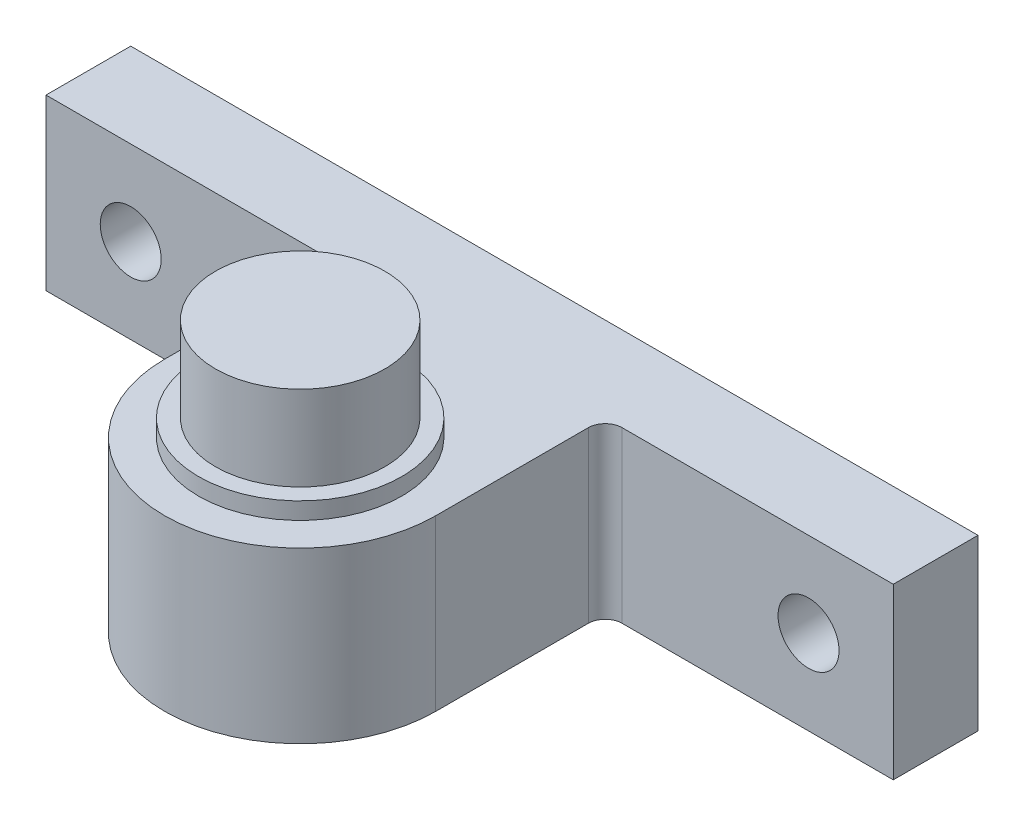
ISO-10303-21;
HEADER;
FILE_DESCRIPTION(('STEP AP214'),'2;1');
FILE_NAME('part.step','',(''),(''),'','','');
FILE_SCHEMA(('AUTOMOTIVE_DESIGN { 1 0 10303 214 1 1 1 1 }'));
ENDSEC;
DATA;
#1=APPLICATION_CONTEXT('core data for automotive mechanical design processes');
#2=APPLICATION_PROTOCOL_DEFINITION('international standard','automotive_design',2000,#1);
#3=PRODUCT_CONTEXT('',#1,'mechanical');
#4=PRODUCT('Part','Part','',(#3));
#5=PRODUCT_RELATED_PRODUCT_CATEGORY('part','',(#4));
#6=PRODUCT_DEFINITION_FORMATION('','',#4);
#7=PRODUCT_DEFINITION_CONTEXT('part definition',#1,'design');
#8=PRODUCT_DEFINITION('design','',#6,#7);
#9=PRODUCT_DEFINITION_SHAPE('','',#8);
#10=(LENGTH_UNIT() NAMED_UNIT(*) SI_UNIT(.MILLI.,.METRE.));
#11=(NAMED_UNIT(*) PLANE_ANGLE_UNIT() SI_UNIT($,.RADIAN.));
#12=(NAMED_UNIT(*) SI_UNIT($,.STERADIAN.) SOLID_ANGLE_UNIT());
#13=UNCERTAINTY_MEASURE_WITH_UNIT(LENGTH_MEASURE(1.E-05),#10,'distance_accuracy_value','');
#14=(GEOMETRIC_REPRESENTATION_CONTEXT(3) GLOBAL_UNCERTAINTY_ASSIGNED_CONTEXT((#13)) GLOBAL_UNIT_ASSIGNED_CONTEXT((#10,
#11,#12)) REPRESENTATION_CONTEXT('',''));
#15=CARTESIAN_POINT('',(0.,0.,0.));
#16=DIRECTION('',(0.,0.,1.));
#17=DIRECTION('',(1.,0.,0.));
#18=AXIS2_PLACEMENT_3D('',#15,#16,#17);
#19=CARTESIAN_POINT('',(0.,10.,0.));
#20=DIRECTION('',(0.,-1.,0.));
#21=DIRECTION('',(0.,0.,-1.));
#22=AXIS2_PLACEMENT_3D('',#19,#20,#21);
#23=CYLINDRICAL_SURFACE('',#22,8.);
#24=CARTESIAN_POINT('',(0.,0.,0.));
#25=DIRECTION('',(0.,1.,0.));
#26=DIRECTION('',(0.,0.,1.));
#27=AXIS2_PLACEMENT_3D('',#24,#25,#26);
#28=CIRCLE('',#27,8.);
#29=CARTESIAN_POINT('',(8.,0.,0.));
#30=VERTEX_POINT('',#29);
#31=CARTESIAN_POINT('',(-8.,0.,0.));
#32=VERTEX_POINT('',#31);
#33=EDGE_CURVE('E130',#30,#32,#28,.F.);
#34=ORIENTED_EDGE('',*,*,#33,.F.);
#35=DIRECTION('',(0.,-1.,0.));
#36=VECTOR('',#35,1.);
#37=CARTESIAN_POINT('',(8.,10.,0.));
#38=LINE('',#37,#36);
#39=CARTESIAN_POINT('',(8.,10.,0.));
#40=VERTEX_POINT('',#39);
#41=EDGE_CURVE('E125',#40,#30,#38,.T.);
#42=ORIENTED_EDGE('',*,*,#41,.F.);
#43=CARTESIAN_POINT('',(0.,10.,0.));
#44=DIRECTION('',(0.,1.,0.));
#45=DIRECTION('',(0.,0.,1.));
#46=AXIS2_PLACEMENT_3D('',#43,#44,#45);
#47=CIRCLE('',#46,8.);
#48=CARTESIAN_POINT('',(-8.,10.,0.));
#49=VERTEX_POINT('',#48);
#50=EDGE_CURVE('E127',#40,#49,#47,.F.);
#51=ORIENTED_EDGE('',*,*,#50,.T.);
#52=DIRECTION('',(0.,-1.,0.));
#53=VECTOR('',#52,1.);
#54=CARTESIAN_POINT('',(-8.,10.,0.));
#55=LINE('',#54,#53);
#56=EDGE_CURVE('E174',#49,#32,#55,.T.);
#57=ORIENTED_EDGE('',*,*,#56,.T.);
#58=EDGE_LOOP('',(#34,#42,#51,#57));
#59=FACE_BOUND('',#58,.T.);
#60=ADVANCED_FACE('F47',(#59),#23,.T.);
#61=CARTESIAN_POINT('',(8.,10.,0.));
#62=DIRECTION('',(-1.,0.,0.));
#63=DIRECTION('',(0.,0.,1.));
#64=AXIS2_PLACEMENT_3D('',#61,#62,#63);
#65=PLANE('',#64);
#66=DIRECTION('',(0.,0.,-1.));
#67=VECTOR('',#66,1.);
#68=CARTESIAN_POINT('',(8.,0.,0.));
#69=LINE('',#68,#67);
#70=CARTESIAN_POINT('',(8.,0.,-9.));
#71=VERTEX_POINT('',#70);
#72=EDGE_CURVE('E177',#30,#71,#69,.T.);
#73=ORIENTED_EDGE('',*,*,#72,.T.);
#74=DIRECTION('',(0.,-1.,0.));
#75=VECTOR('',#74,1.);
#76=CARTESIAN_POINT('',(8.,10.,-9.));
#77=LINE('',#76,#75);
#78=CARTESIAN_POINT('',(8.,10.,-9.));
#79=VERTEX_POINT('',#78);
#80=EDGE_CURVE('E63',#71,#79,#77,.F.);
#81=ORIENTED_EDGE('',*,*,#80,.T.);
#82=DIRECTION('',(0.,0.,-1.));
#83=VECTOR('',#82,1.);
#84=CARTESIAN_POINT('',(8.,10.,0.));
#85=LINE('',#84,#83);
#86=EDGE_CURVE('E135',#40,#79,#85,.T.);
#87=ORIENTED_EDGE('',*,*,#86,.F.);
#88=ORIENTED_EDGE('',*,*,#41,.T.);
#89=EDGE_LOOP('',(#73,#81,#87,#88));
#90=FACE_BOUND('',#89,.T.);
#91=ADVANCED_FACE('F136',(#90),#65,.F.);
#92=CARTESIAN_POINT('',(0.,10.,-10.));
#93=DIRECTION('',(0.,0.,-1.));
#94=DIRECTION('',(-1.,0.,0.));
#95=AXIS2_PLACEMENT_3D('',#92,#93,#94);
#96=PLANE('',#95);
#97=CARTESIAN_POINT('',(20.,4.99999999999999,-10.));
#98=DIRECTION('',(0.,0.,-1.));
#99=DIRECTION('',(-1.,0.,0.));
#100=AXIS2_PLACEMENT_3D('',#97,#98,#99);
#101=CIRCLE('',#100,1.8);
#102=CARTESIAN_POINT('',(18.2,4.99999999999999,-10.));
#103=VERTEX_POINT('',#102);
#104=EDGE_CURVE('E221',#103,#103,#101,.T.);
#105=ORIENTED_EDGE('',*,*,#104,.T.);
#106=EDGE_LOOP('',(#105));
#107=FACE_BOUND('',#106,.T.);
#108=DIRECTION('',(1.,0.,0.));
#109=VECTOR('',#108,1.);
#110=CARTESIAN_POINT('',(0.,10.,-10.));
#111=LINE('',#110,#109);
#112=CARTESIAN_POINT('',(9.,10.,-10.));
#113=VERTEX_POINT('',#112);
#114=CARTESIAN_POINT('',(25.,10.,-10.));
#115=VERTEX_POINT('',#114);
#116=EDGE_CURVE('E140',#113,#115,#111,.T.);
#117=ORIENTED_EDGE('',*,*,#116,.F.);
#118=DIRECTION('',(0.,-1.,0.));
#119=VECTOR('',#118,1.);
#120=CARTESIAN_POINT('',(9.,0.,-10.));
#121=LINE('',#120,#119);
#122=CARTESIAN_POINT('',(9.,0.,-10.));
#123=VERTEX_POINT('',#122);
#124=EDGE_CURVE('E229',#113,#123,#121,.T.);
#125=ORIENTED_EDGE('',*,*,#124,.T.);
#126=DIRECTION('',(1.,0.,0.));
#127=VECTOR('',#126,1.);
#128=CARTESIAN_POINT('',(0.,0.,-10.));
#129=LINE('',#128,#127);
#130=CARTESIAN_POINT('',(25.,0.,-10.));
#131=VERTEX_POINT('',#130);
#132=EDGE_CURVE('E180',#123,#131,#129,.T.);
#133=ORIENTED_EDGE('',*,*,#132,.T.);
#134=DIRECTION('',(0.,-1.,0.));
#135=VECTOR('',#134,1.);
#136=CARTESIAN_POINT('',(25.,10.,-10.));
#137=LINE('',#136,#135);
#138=EDGE_CURVE('E133',#115,#131,#137,.T.);
#139=ORIENTED_EDGE('',*,*,#138,.F.);
#140=EDGE_LOOP('',(#117,#125,#133,#139));
#141=FACE_BOUND('',#140,.T.);
#142=ADVANCED_FACE('F271',(#107,#141),#96,.F.);
#143=CARTESIAN_POINT('',(25.,10.,0.));
#144=DIRECTION('',(-1.,0.,0.));
#145=DIRECTION('',(0.,0.,1.));
#146=AXIS2_PLACEMENT_3D('',#143,#144,#145);
#147=PLANE('',#146);
#148=DIRECTION('',(0.,0.,-1.));
#149=VECTOR('',#148,1.);
#150=CARTESIAN_POINT('',(25.,0.,0.));
#151=LINE('',#150,#149);
#152=CARTESIAN_POINT('',(25.,0.,-15.));
#153=VERTEX_POINT('',#152);
#154=EDGE_CURVE('E183',#131,#153,#151,.T.);
#155=ORIENTED_EDGE('',*,*,#154,.T.);
#156=DIRECTION('',(0.,-1.,0.));
#157=VECTOR('',#156,1.);
#158=CARTESIAN_POINT('',(25.,10.,-15.));
#159=LINE('',#158,#157);
#160=CARTESIAN_POINT('',(25.,10.,-15.));
#161=VERTEX_POINT('',#160);
#162=EDGE_CURVE('E206',#161,#153,#159,.T.);
#163=ORIENTED_EDGE('',*,*,#162,.F.);
#164=DIRECTION('',(0.,0.,-1.));
#165=VECTOR('',#164,1.);
#166=CARTESIAN_POINT('',(25.,10.,0.));
#167=LINE('',#166,#165);
#168=EDGE_CURVE('E158',#115,#161,#167,.T.);
#169=ORIENTED_EDGE('',*,*,#168,.F.);
#170=ORIENTED_EDGE('',*,*,#138,.T.);
#171=EDGE_LOOP('',(#155,#163,#169,#170));
#172=FACE_BOUND('',#171,.T.);
#173=ADVANCED_FACE('F267',(#172),#147,.F.);
#174=CARTESIAN_POINT('',(0.,10.,-15.));
#175=DIRECTION('',(0.,0.,-1.));
#176=DIRECTION('',(-1.,0.,0.));
#177=AXIS2_PLACEMENT_3D('',#174,#175,#176);
#178=PLANE('',#177);
#179=CARTESIAN_POINT('',(-20.,5.,-15.));
#180=DIRECTION('',(0.,0.,-1.));
#181=DIRECTION('',(-1.,0.,0.));
#182=AXIS2_PLACEMENT_3D('',#179,#180,#181);
#183=CIRCLE('',#182,1.8);
#184=CARTESIAN_POINT('',(-21.8,5.,-15.));
#185=VERTEX_POINT('',#184);
#186=EDGE_CURVE('E222',#185,#185,#183,.T.);
#187=ORIENTED_EDGE('',*,*,#186,.F.);
#188=EDGE_LOOP('',(#187));
#189=FACE_BOUND('',#188,.T.);
#190=CARTESIAN_POINT('',(20.,4.99999999999999,-15.));
#191=DIRECTION('',(0.,0.,-1.));
#192=DIRECTION('',(-1.,0.,0.));
#193=AXIS2_PLACEMENT_3D('',#190,#191,#192);
#194=CIRCLE('',#193,1.8);
#195=CARTESIAN_POINT('',(18.2,4.99999999999999,-15.));
#196=VERTEX_POINT('',#195);
#197=EDGE_CURVE('E335',#196,#196,#194,.T.);
#198=ORIENTED_EDGE('',*,*,#197,.F.);
#199=EDGE_LOOP('',(#198));
#200=FACE_BOUND('',#199,.T.);
#201=DIRECTION('',(1.,0.,0.));
#202=VECTOR('',#201,1.);
#203=CARTESIAN_POINT('',(0.,0.,-15.));
#204=LINE('',#203,#202);
#205=CARTESIAN_POINT('',(-25.,0.,-15.));
#206=VERTEX_POINT('',#205);
#207=EDGE_CURVE('E187',#206,#153,#204,.T.);
#208=ORIENTED_EDGE('',*,*,#207,.F.);
#209=DIRECTION('',(0.,-1.,0.));
#210=VECTOR('',#209,1.);
#211=CARTESIAN_POINT('',(-25.,10.,-15.));
#212=LINE('',#211,#210);
#213=CARTESIAN_POINT('',(-25.,10.,-15.));
#214=VERTEX_POINT('',#213);
#215=EDGE_CURVE('E203',#214,#206,#212,.T.);
#216=ORIENTED_EDGE('',*,*,#215,.F.);
#217=DIRECTION('',(1.,0.,0.));
#218=VECTOR('',#217,1.);
#219=CARTESIAN_POINT('',(0.,10.,-15.));
#220=LINE('',#219,#218);
#221=EDGE_CURVE('E161',#214,#161,#220,.T.);
#222=ORIENTED_EDGE('',*,*,#221,.T.);
#223=ORIENTED_EDGE('',*,*,#162,.T.);
#224=EDGE_LOOP('',(#208,#216,#222,#223));
#225=FACE_BOUND('',#224,.T.);
#226=ADVANCED_FACE('F262',(#189,#200,#225),#178,.T.);
#227=CARTESIAN_POINT('',(-25.,10.,0.));
#228=DIRECTION('',(-1.,0.,0.));
#229=DIRECTION('',(0.,0.,1.));
#230=AXIS2_PLACEMENT_3D('',#227,#228,#229);
#231=PLANE('',#230);
#232=DIRECTION('',(0.,0.,-1.));
#233=VECTOR('',#232,1.);
#234=CARTESIAN_POINT('',(-25.,0.,0.));
#235=LINE('',#234,#233);
#236=CARTESIAN_POINT('',(-25.,0.,-10.));
#237=VERTEX_POINT('',#236);
#238=EDGE_CURVE('E191',#237,#206,#235,.T.);
#239=ORIENTED_EDGE('',*,*,#238,.F.);
#240=DIRECTION('',(0.,-1.,0.));
#241=VECTOR('',#240,1.);
#242=CARTESIAN_POINT('',(-25.,10.,-10.));
#243=LINE('',#242,#241);
#244=CARTESIAN_POINT('',(-25.,10.,-10.));
#245=VERTEX_POINT('',#244);
#246=EDGE_CURVE('E199',#245,#237,#243,.T.);
#247=ORIENTED_EDGE('',*,*,#246,.F.);
#248=DIRECTION('',(0.,0.,-1.));
#249=VECTOR('',#248,1.);
#250=CARTESIAN_POINT('',(-25.,10.,0.));
#251=LINE('',#250,#249);
#252=EDGE_CURVE('E165',#245,#214,#251,.T.);
#253=ORIENTED_EDGE('',*,*,#252,.T.);
#254=ORIENTED_EDGE('',*,*,#215,.T.);
#255=EDGE_LOOP('',(#239,#247,#253,#254));
#256=FACE_BOUND('',#255,.T.);
#257=ADVANCED_FACE('F258',(#256),#231,.T.);
#258=CARTESIAN_POINT('',(0.,10.,-10.));
#259=DIRECTION('',(0.,0.,1.));
#260=DIRECTION('',(1.,0.,0.));
#261=AXIS2_PLACEMENT_3D('',#258,#259,#260);
#262=PLANE('',#261);
#263=CARTESIAN_POINT('',(-20.,5.,-10.));
#264=DIRECTION('',(0.,0.,1.));
#265=DIRECTION('',(1.,0.,0.));
#266=AXIS2_PLACEMENT_3D('',#263,#264,#265);
#267=CIRCLE('',#266,1.8);
#268=CARTESIAN_POINT('',(-18.2,5.,-10.));
#269=VERTEX_POINT('',#268);
#270=EDGE_CURVE('E217',#269,#269,#267,.T.);
#271=ORIENTED_EDGE('',*,*,#270,.F.);
#272=EDGE_LOOP('',(#271));
#273=FACE_BOUND('',#272,.T.);
#274=DIRECTION('',(-1.,0.,0.));
#275=VECTOR('',#274,1.);
#276=CARTESIAN_POINT('',(0.,0.,-10.));
#277=LINE('',#276,#275);
#278=CARTESIAN_POINT('',(-9.,0.,-10.));
#279=VERTEX_POINT('',#278);
#280=EDGE_CURVE('E150',#279,#237,#277,.T.);
#281=ORIENTED_EDGE('',*,*,#280,.F.);
#282=DIRECTION('',(0.,-1.,0.));
#283=VECTOR('',#282,1.);
#284=CARTESIAN_POINT('',(-9.,10.,-10.));
#285=LINE('',#284,#283);
#286=CARTESIAN_POINT('',(-9.,10.,-10.));
#287=VERTEX_POINT('',#286);
#288=EDGE_CURVE('E226',#279,#287,#285,.F.);
#289=ORIENTED_EDGE('',*,*,#288,.T.);
#290=DIRECTION('',(-1.,0.,0.));
#291=VECTOR('',#290,1.);
#292=CARTESIAN_POINT('',(0.,10.,-10.));
#293=LINE('',#292,#291);
#294=EDGE_CURVE('E169',#287,#245,#293,.T.);
#295=ORIENTED_EDGE('',*,*,#294,.T.);
#296=ORIENTED_EDGE('',*,*,#246,.T.);
#297=EDGE_LOOP('',(#281,#289,#295,#296));
#298=FACE_BOUND('',#297,.T.);
#299=ADVANCED_FACE('F254',(#273,#298),#262,.T.);
#300=CARTESIAN_POINT('',(-8.,10.,0.));
#301=DIRECTION('',(-1.,0.,0.));
#302=DIRECTION('',(0.,0.,1.));
#303=AXIS2_PLACEMENT_3D('',#300,#301,#302);
#304=PLANE('',#303);
#305=DIRECTION('',(0.,0.,-1.));
#306=VECTOR('',#305,1.);
#307=CARTESIAN_POINT('',(-8.,10.,0.));
#308=LINE('',#307,#306);
#309=CARTESIAN_POINT('',(-8.,10.,-9.));
#310=VERTEX_POINT('',#309);
#311=EDGE_CURVE('E144',#49,#310,#308,.T.);
#312=ORIENTED_EDGE('',*,*,#311,.T.);
#313=DIRECTION('',(0.,-1.,0.));
#314=VECTOR('',#313,1.);
#315=CARTESIAN_POINT('',(-8.,0.,-9.));
#316=LINE('',#315,#314);
#317=CARTESIAN_POINT('',(-8.,0.,-9.));
#318=VERTEX_POINT('',#317);
#319=EDGE_CURVE('E132',#310,#318,#316,.T.);
#320=ORIENTED_EDGE('',*,*,#319,.T.);
#321=DIRECTION('',(0.,0.,-1.));
#322=VECTOR('',#321,1.);
#323=CARTESIAN_POINT('',(-8.,0.,0.));
#324=LINE('',#323,#322);
#325=EDGE_CURVE('E146',#32,#318,#324,.T.);
#326=ORIENTED_EDGE('',*,*,#325,.F.);
#327=ORIENTED_EDGE('',*,*,#56,.F.);
#328=EDGE_LOOP('',(#312,#320,#326,#327));
#329=FACE_BOUND('',#328,.T.);
#330=ADVANCED_FACE('F248',(#329),#304,.T.);
#331=CARTESIAN_POINT('',(0.,10.,0.));
#332=DIRECTION('',(0.,1.,0.));
#333=DIRECTION('',(0.,0.,1.));
#334=AXIS2_PLACEMENT_3D('',#331,#332,#333);
#335=PLANE('',#334);
#336=CARTESIAN_POINT('',(0.,10.,0.));
#337=DIRECTION('',(0.,1.,0.));
#338=DIRECTION('',(0.,0.,1.));
#339=AXIS2_PLACEMENT_3D('',#336,#337,#338);
#340=CIRCLE('',#339,6.);
#341=CARTESIAN_POINT('',(0.,10.,6.));
#342=VERTEX_POINT('',#341);
#343=EDGE_CURVE('E344',#342,#342,#340,.T.);
#344=ORIENTED_EDGE('',*,*,#343,.F.);
#345=EDGE_LOOP('',(#344));
#346=FACE_BOUND('',#345,.T.);
#347=ORIENTED_EDGE('',*,*,#50,.F.);
#348=ORIENTED_EDGE('',*,*,#86,.T.);
#349=CARTESIAN_POINT('',(9.,10.,-9.));
#350=DIRECTION('',(0.,1.,0.));
#351=DIRECTION('',(0.,0.,1.));
#352=AXIS2_PLACEMENT_3D('',#349,#350,#351);
#353=CIRCLE('',#352,1.);
#354=EDGE_CURVE('E11',#79,#113,#353,.F.);
#355=ORIENTED_EDGE('',*,*,#354,.T.);
#356=ORIENTED_EDGE('',*,*,#116,.T.);
#357=ORIENTED_EDGE('',*,*,#168,.T.);
#358=ORIENTED_EDGE('',*,*,#221,.F.);
#359=ORIENTED_EDGE('',*,*,#252,.F.);
#360=ORIENTED_EDGE('',*,*,#294,.F.);
#361=CARTESIAN_POINT('',(-9.,10.,-9.));
#362=DIRECTION('',(0.,1.,0.));
#363=DIRECTION('',(0.,0.,1.));
#364=AXIS2_PLACEMENT_3D('',#361,#362,#363);
#365=CIRCLE('',#364,1.);
#366=EDGE_CURVE('E238',#287,#310,#365,.F.);
#367=ORIENTED_EDGE('',*,*,#366,.T.);
#368=ORIENTED_EDGE('',*,*,#311,.F.);
#369=EDGE_LOOP('',(#347,#348,#355,#356,#357,#358,#359,#360,#367,#368));
#370=FACE_BOUND('',#369,.T.);
#371=ADVANCED_FACE('F142',(#346,#370),#335,.T.);
#372=CARTESIAN_POINT('',(0.,0.,0.));
#373=DIRECTION('',(0.,1.,0.));
#374=DIRECTION('',(0.,0.,1.));
#375=AXIS2_PLACEMENT_3D('',#372,#373,#374);
#376=PLANE('',#375);
#377=ORIENTED_EDGE('',*,*,#33,.T.);
#378=ORIENTED_EDGE('',*,*,#325,.T.);
#379=CARTESIAN_POINT('',(-9.,0.,-9.));
#380=DIRECTION('',(0.,1.,0.));
#381=DIRECTION('',(0.,0.,1.));
#382=AXIS2_PLACEMENT_3D('',#379,#380,#381);
#383=CIRCLE('',#382,1.);
#384=EDGE_CURVE('E235',#318,#279,#383,.T.);
#385=ORIENTED_EDGE('',*,*,#384,.T.);
#386=ORIENTED_EDGE('',*,*,#280,.T.);
#387=ORIENTED_EDGE('',*,*,#238,.T.);
#388=ORIENTED_EDGE('',*,*,#207,.T.);
#389=ORIENTED_EDGE('',*,*,#154,.F.);
#390=ORIENTED_EDGE('',*,*,#132,.F.);
#391=CARTESIAN_POINT('',(9.,0.,-9.));
#392=DIRECTION('',(0.,1.,0.));
#393=DIRECTION('',(0.,0.,1.));
#394=AXIS2_PLACEMENT_3D('',#391,#392,#393);
#395=CIRCLE('',#394,1.);
#396=EDGE_CURVE('E56',#123,#71,#395,.T.);
#397=ORIENTED_EDGE('',*,*,#396,.T.);
#398=ORIENTED_EDGE('',*,*,#72,.F.);
#399=EDGE_LOOP('',(#377,#378,#385,#386,#387,#388,#389,#390,#397,#398));
#400=FACE_BOUND('',#399,.T.);
#401=ADVANCED_FACE('F252',(#400),#376,.F.);
#402=CARTESIAN_POINT('',(0.,11.,0.));
#403=DIRECTION('',(0.,-1.,0.));
#404=DIRECTION('',(0.,0.,-1.));
#405=AXIS2_PLACEMENT_3D('',#402,#403,#404);
#406=CYLINDRICAL_SURFACE('',#405,6.);
#407=CARTESIAN_POINT('',(0.,11.,0.));
#408=DIRECTION('',(0.,1.,0.));
#409=DIRECTION('',(0.,0.,1.));
#410=AXIS2_PLACEMENT_3D('',#407,#408,#409);
#411=CIRCLE('',#410,6.);
#412=CARTESIAN_POINT('',(0.,11.,6.));
#413=VERTEX_POINT('',#412);
#414=EDGE_CURVE('E216',#413,#413,#411,.T.);
#415=ORIENTED_EDGE('',*,*,#414,.F.);
#416=EDGE_LOOP('',(#415));
#417=FACE_BOUND('',#416,.T.);
#418=ORIENTED_EDGE('',*,*,#343,.T.);
#419=EDGE_LOOP('',(#418));
#420=FACE_BOUND('',#419,.T.);
#421=ADVANCED_FACE('F303',(#417,#420),#406,.T.);
#422=CARTESIAN_POINT('',(0.,11.,0.));
#423=DIRECTION('',(0.,1.,0.));
#424=DIRECTION('',(0.,0.,1.));
#425=AXIS2_PLACEMENT_3D('',#422,#423,#424);
#426=PLANE('',#425);
#427=CARTESIAN_POINT('',(0.,11.,0.));
#428=DIRECTION('',(0.,1.,0.));
#429=DIRECTION('',(0.,0.,1.));
#430=AXIS2_PLACEMENT_3D('',#427,#428,#429);
#431=CIRCLE('',#430,5.);
#432=CARTESIAN_POINT('',(0.,11.,5.));
#433=VERTEX_POINT('',#432);
#434=EDGE_CURVE('E212',#433,#433,#431,.T.);
#435=ORIENTED_EDGE('',*,*,#434,.F.);
#436=EDGE_LOOP('',(#435));
#437=FACE_BOUND('',#436,.T.);
#438=ORIENTED_EDGE('',*,*,#414,.T.);
#439=EDGE_LOOP('',(#438));
#440=FACE_BOUND('',#439,.T.);
#441=ADVANCED_FACE('F315',(#437,#440),#426,.T.);
#442=CARTESIAN_POINT('',(0.,16.,0.));
#443=DIRECTION('',(0.,1.,0.));
#444=DIRECTION('',(0.,0.,1.));
#445=AXIS2_PLACEMENT_3D('',#442,#443,#444);
#446=PLANE('',#445);
#447=CARTESIAN_POINT('',(0.,16.,0.));
#448=DIRECTION('',(0.,1.,0.));
#449=DIRECTION('',(0.,0.,1.));
#450=AXIS2_PLACEMENT_3D('',#447,#448,#449);
#451=CIRCLE('',#450,5.);
#452=CARTESIAN_POINT('',(0.,16.,5.));
#453=VERTEX_POINT('',#452);
#454=EDGE_CURVE('E153',#453,#453,#451,.T.);
#455=ORIENTED_EDGE('',*,*,#454,.T.);
#456=EDGE_LOOP('',(#455));
#457=FACE_BOUND('',#456,.T.);
#458=ADVANCED_FACE('F311',(#457),#446,.T.);
#459=CARTESIAN_POINT('',(0.,16.,0.));
#460=DIRECTION('',(0.,-1.,0.));
#461=DIRECTION('',(0.,0.,-1.));
#462=AXIS2_PLACEMENT_3D('',#459,#460,#461);
#463=CYLINDRICAL_SURFACE('',#462,5.);
#464=ORIENTED_EDGE('',*,*,#434,.T.);
#465=EDGE_LOOP('',(#464));
#466=FACE_BOUND('',#465,.T.);
#467=ORIENTED_EDGE('',*,*,#454,.F.);
#468=EDGE_LOOP('',(#467));
#469=FACE_BOUND('',#468,.T.);
#470=ADVANCED_FACE('F307',(#466,#469),#463,.T.);
#471=CARTESIAN_POINT('',(-20.,5.,8.));
#472=DIRECTION('',(0.,0.,-1.));
#473=DIRECTION('',(-1.,0.,0.));
#474=AXIS2_PLACEMENT_3D('',#471,#472,#473);
#475=CYLINDRICAL_SURFACE('',#474,1.8);
#476=ORIENTED_EDGE('',*,*,#270,.T.);
#477=EDGE_LOOP('',(#476));
#478=FACE_BOUND('',#477,.T.);
#479=ORIENTED_EDGE('',*,*,#186,.T.);
#480=EDGE_LOOP('',(#479));
#481=FACE_BOUND('',#480,.T.);
#482=ADVANCED_FACE('F310',(#478,#481),#475,.F.);
#483=CARTESIAN_POINT('',(20.,4.99999999999999,8.));
#484=DIRECTION('',(0.,0.,-1.));
#485=DIRECTION('',(-1.,0.,0.));
#486=AXIS2_PLACEMENT_3D('',#483,#484,#485);
#487=CYLINDRICAL_SURFACE('',#486,1.8);
#488=ORIENTED_EDGE('',*,*,#197,.T.);
#489=EDGE_LOOP('',(#488));
#490=FACE_BOUND('',#489,.T.);
#491=ORIENTED_EDGE('',*,*,#104,.F.);
#492=EDGE_LOOP('',(#491));
#493=FACE_BOUND('',#492,.T.);
#494=ADVANCED_FACE('F278',(#490,#493),#487,.F.);
#495=CARTESIAN_POINT('',(-9.,10.,-9.));
#496=DIRECTION('',(0.,1.,0.));
#497=DIRECTION('',(0.,0.,1.));
#498=AXIS2_PLACEMENT_3D('',#495,#496,#497);
#499=CYLINDRICAL_SURFACE('',#498,1.);
#500=ORIENTED_EDGE('',*,*,#366,.F.);
#501=ORIENTED_EDGE('',*,*,#288,.F.);
#502=ORIENTED_EDGE('',*,*,#384,.F.);
#503=ORIENTED_EDGE('',*,*,#319,.F.);
#504=EDGE_LOOP('',(#500,#501,#502,#503));
#505=FACE_BOUND('',#504,.T.);
#506=ADVANCED_FACE('F250',(#505),#499,.F.);
#507=CARTESIAN_POINT('',(9.,10.,-9.));
#508=DIRECTION('',(0.,1.,0.));
#509=DIRECTION('',(0.,0.,1.));
#510=AXIS2_PLACEMENT_3D('',#507,#508,#509);
#511=CYLINDRICAL_SURFACE('',#510,1.);
#512=ORIENTED_EDGE('',*,*,#354,.F.);
#513=ORIENTED_EDGE('',*,*,#80,.F.);
#514=ORIENTED_EDGE('',*,*,#396,.F.);
#515=ORIENTED_EDGE('',*,*,#124,.F.);
#516=EDGE_LOOP('',(#512,#513,#514,#515));
#517=FACE_BOUND('',#516,.T.);
#518=ADVANCED_FACE('F49',(#517),#511,.F.);
#519=CLOSED_SHELL('',(#60,#91,#142,#173,#226,#257,#299,#330,#371,#401,#421,#441,#458,#470,#482,
#494,#506,#518));
#520=MANIFOLD_SOLID_BREP('B2',#519);
#521=ADVANCED_BREP_SHAPE_REPRESENTATION('',(#18,#520),#14);
#522=SHAPE_DEFINITION_REPRESENTATION(#9,#521);
ENDSEC;
END-ISO-10303-21;
